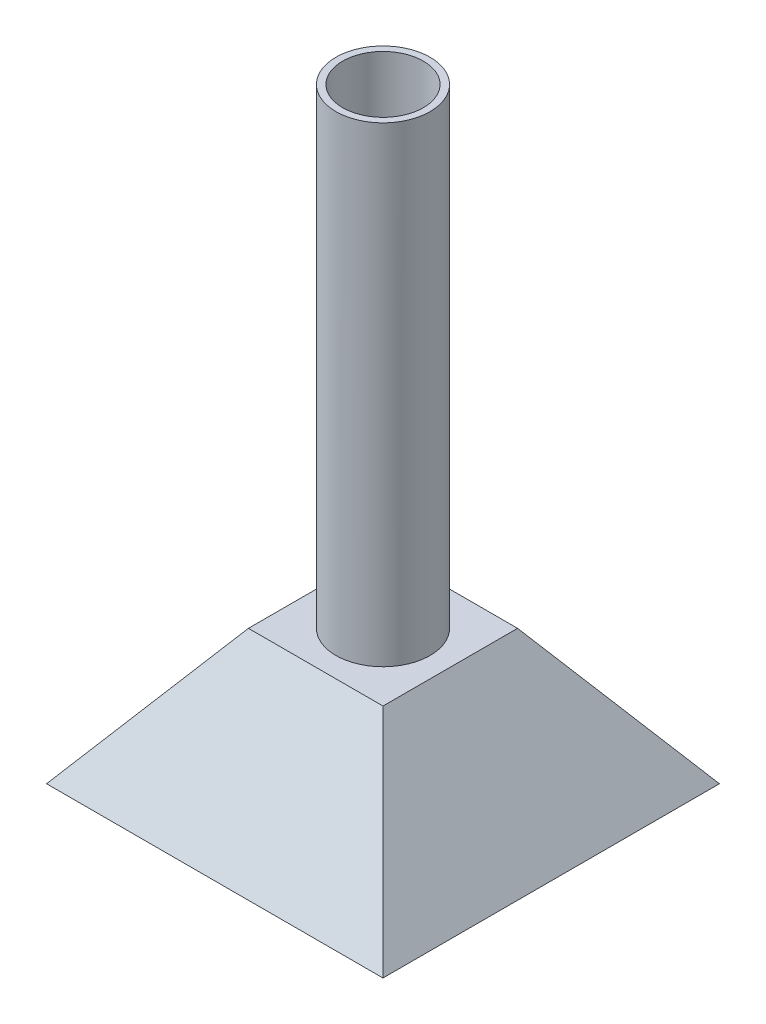
ISO-10303-21;
HEADER;
FILE_DESCRIPTION(('STEP AP214'),'2;1');
FILE_NAME('part.step','',(''),(''),'','','');
FILE_SCHEMA(('AUTOMOTIVE_DESIGN { 1 0 10303 214 1 1 1 1 }'));
ENDSEC;
DATA;
#1=APPLICATION_CONTEXT('core data for automotive mechanical design processes');
#2=APPLICATION_PROTOCOL_DEFINITION('international standard','automotive_design',2000,#1);
#3=PRODUCT_CONTEXT('',#1,'mechanical');
#4=PRODUCT('Part','Part','',(#3));
#5=PRODUCT_RELATED_PRODUCT_CATEGORY('part','',(#4));
#6=PRODUCT_DEFINITION_FORMATION('','',#4);
#7=PRODUCT_DEFINITION_CONTEXT('part definition',#1,'design');
#8=PRODUCT_DEFINITION('design','',#6,#7);
#9=PRODUCT_DEFINITION_SHAPE('','',#8);
#10=(LENGTH_UNIT() NAMED_UNIT(*) SI_UNIT(.MILLI.,.METRE.));
#11=(NAMED_UNIT(*) PLANE_ANGLE_UNIT() SI_UNIT($,.RADIAN.));
#12=(NAMED_UNIT(*) SI_UNIT($,.STERADIAN.) SOLID_ANGLE_UNIT());
#13=UNCERTAINTY_MEASURE_WITH_UNIT(LENGTH_MEASURE(1.E-05),#10,'distance_accuracy_value','');
#14=(GEOMETRIC_REPRESENTATION_CONTEXT(3) GLOBAL_UNCERTAINTY_ASSIGNED_CONTEXT((#13)) GLOBAL_UNIT_ASSIGNED_CONTEXT((#10,
#11,#12)) REPRESENTATION_CONTEXT('',''));
#15=CARTESIAN_POINT('',(0.,0.,0.));
#16=DIRECTION('',(0.,0.,1.));
#17=DIRECTION('',(1.,0.,0.));
#18=AXIS2_PLACEMENT_3D('',#15,#16,#17);
#19=CARTESIAN_POINT('',(0.,0.,0.));
#20=DIRECTION('',(0.,-1.,0.));
#21=DIRECTION('',(0.,0.,-1.));
#22=AXIS2_PLACEMENT_3D('',#19,#20,#21);
#23=PLANE('',#22);
#24=DIRECTION('',(0.,0.,-1.));
#25=VECTOR('',#24,1.);
#26=CARTESIAN_POINT('',(63.5,0.,63.5));
#27=LINE('',#26,#25);
#28=CARTESIAN_POINT('',(63.5,0.,63.5));
#29=VERTEX_POINT('',#28);
#30=CARTESIAN_POINT('',(63.5,0.,-63.5));
#31=VERTEX_POINT('',#30);
#32=EDGE_CURVE('E173',#29,#31,#27,.T.);
#33=ORIENTED_EDGE('',*,*,#32,.F.);
#34=DIRECTION('',(1.,0.,0.));
#35=VECTOR('',#34,1.);
#36=CARTESIAN_POINT('',(-63.5,0.,63.5));
#37=LINE('',#36,#35);
#38=CARTESIAN_POINT('',(-63.5,0.,63.5));
#39=VERTEX_POINT('',#38);
#40=EDGE_CURVE('E57',#39,#29,#37,.T.);
#41=ORIENTED_EDGE('',*,*,#40,.F.);
#42=DIRECTION('',(0.,0.,1.));
#43=VECTOR('',#42,1.);
#44=CARTESIAN_POINT('',(-63.5,0.,63.5));
#45=LINE('',#44,#43);
#46=CARTESIAN_POINT('',(-63.5,0.,-63.5));
#47=VERTEX_POINT('',#46);
#48=EDGE_CURVE('E99',#47,#39,#45,.T.);
#49=ORIENTED_EDGE('',*,*,#48,.F.);
#50=DIRECTION('',(-1.,0.,0.));
#51=VECTOR('',#50,1.);
#52=CARTESIAN_POINT('',(-63.5,0.,-63.5));
#53=LINE('',#52,#51);
#54=EDGE_CURVE('E194',#31,#47,#53,.T.);
#55=ORIENTED_EDGE('',*,*,#54,.F.);
#56=EDGE_LOOP('',(#33,#41,#49,#55));
#57=FACE_BOUND('',#56,.T.);
#58=ADVANCED_FACE('F49',(#57),#23,.T.);
#59=CARTESIAN_POINT('',(0.,50.8,0.));
#60=DIRECTION('',(0.,-1.,0.));
#61=DIRECTION('',(0.,0.,-1.));
#62=AXIS2_PLACEMENT_3D('',#59,#60,#61);
#63=PLANE('',#62);
#64=CARTESIAN_POINT('',(0.,50.8,0.));
#65=DIRECTION('',(0.,-1.,0.));
#66=DIRECTION('',(0.,0.,-1.));
#67=AXIS2_PLACEMENT_3D('',#64,#65,#66);
#68=CIRCLE('',#67,17.78);
#69=CARTESIAN_POINT('',(0.,50.8,-17.78));
#70=VERTEX_POINT('',#69);
#71=EDGE_CURVE('E12',#70,#70,#68,.F.);
#72=ORIENTED_EDGE('',*,*,#71,.F.);
#73=EDGE_LOOP('',(#72));
#74=FACE_BOUND('',#73,.T.);
#75=DIRECTION('',(0.,0.,-1.));
#76=VECTOR('',#75,1.);
#77=CARTESIAN_POINT('',(25.4,50.8,25.4));
#78=LINE('',#77,#76);
#79=CARTESIAN_POINT('',(25.4,50.8,25.4));
#80=VERTEX_POINT('',#79);
#81=CARTESIAN_POINT('',(25.4,50.8,-25.4));
#82=VERTEX_POINT('',#81);
#83=EDGE_CURVE('E161',#80,#82,#78,.T.);
#84=ORIENTED_EDGE('',*,*,#83,.T.);
#85=DIRECTION('',(-1.,0.,0.));
#86=VECTOR('',#85,1.);
#87=CARTESIAN_POINT('',(-25.4,50.8,-25.4));
#88=LINE('',#87,#86);
#89=CARTESIAN_POINT('',(-25.4,50.8,-25.4));
#90=VERTEX_POINT('',#89);
#91=EDGE_CURVE('E117',#82,#90,#88,.T.);
#92=ORIENTED_EDGE('',*,*,#91,.T.);
#93=DIRECTION('',(0.,0.,1.));
#94=VECTOR('',#93,1.);
#95=CARTESIAN_POINT('',(-25.4,50.8,25.4));
#96=LINE('',#95,#94);
#97=CARTESIAN_POINT('',(-25.4,50.8,25.4));
#98=VERTEX_POINT('',#97);
#99=EDGE_CURVE('E96',#90,#98,#96,.T.);
#100=ORIENTED_EDGE('',*,*,#99,.T.);
#101=DIRECTION('',(1.,0.,0.));
#102=VECTOR('',#101,1.);
#103=CARTESIAN_POINT('',(-25.4,50.8,25.4));
#104=LINE('',#103,#102);
#105=EDGE_CURVE('E105',#98,#80,#104,.T.);
#106=ORIENTED_EDGE('',*,*,#105,.T.);
#107=EDGE_LOOP('',(#84,#92,#100,#106));
#108=FACE_BOUND('',#107,.T.);
#109=ADVANCED_FACE('F116',(#74,#108),#63,.F.);
#110=CARTESIAN_POINT('',(-40.64,30.48,0.));
#111=DIRECTION('',(-0.8,0.6,0.));
#112=DIRECTION('',(-0.6,-0.8,0.));
#113=AXIS2_PLACEMENT_3D('',#110,#111,#112);
#114=PLANE('',#113);
#115=DIRECTION('',(-0.514495755427527,-0.685994340570035,-0.514495755427527));
#116=VECTOR('',#115,1.);
#117=CARTESIAN_POINT('',(-25.4,50.8,-25.4));
#118=LINE('',#117,#116);
#119=EDGE_CURVE('E103',#90,#47,#118,.T.);
#120=ORIENTED_EDGE('',*,*,#119,.T.);
#121=ORIENTED_EDGE('',*,*,#48,.T.);
#122=DIRECTION('',(-0.514495755427527,-0.685994340570035,0.514495755427527));
#123=VECTOR('',#122,1.);
#124=CARTESIAN_POINT('',(-25.4,50.8,25.4));
#125=LINE('',#124,#123);
#126=EDGE_CURVE('E91',#98,#39,#125,.T.);
#127=ORIENTED_EDGE('',*,*,#126,.F.);
#128=ORIENTED_EDGE('',*,*,#99,.F.);
#129=EDGE_LOOP('',(#120,#121,#127,#128));
#130=FACE_BOUND('',#129,.T.);
#131=ADVANCED_FACE('F94',(#130),#114,.T.);
#132=CARTESIAN_POINT('',(0.,30.48,40.64));
#133=DIRECTION('',(0.,0.6,0.8));
#134=DIRECTION('',(0.,-0.8,0.6));
#135=AXIS2_PLACEMENT_3D('',#132,#133,#134);
#136=PLANE('',#135);
#137=ORIENTED_EDGE('',*,*,#126,.T.);
#138=ORIENTED_EDGE('',*,*,#40,.T.);
#139=DIRECTION('',(0.514495755427527,-0.685994340570035,0.514495755427527));
#140=VECTOR('',#139,1.);
#141=CARTESIAN_POINT('',(25.4,50.8,25.4));
#142=LINE('',#141,#140);
#143=EDGE_CURVE('E64',#80,#29,#142,.T.);
#144=ORIENTED_EDGE('',*,*,#143,.F.);
#145=ORIENTED_EDGE('',*,*,#105,.F.);
#146=EDGE_LOOP('',(#137,#138,#144,#145));
#147=FACE_BOUND('',#146,.T.);
#148=ADVANCED_FACE('F107',(#147),#136,.T.);
#149=CARTESIAN_POINT('',(0.,30.48,-40.64));
#150=DIRECTION('',(0.,0.6,-0.8));
#151=DIRECTION('',(0.,0.8,0.6));
#152=AXIS2_PLACEMENT_3D('',#149,#150,#151);
#153=PLANE('',#152);
#154=DIRECTION('',(0.514495755427527,-0.685994340570035,-0.514495755427527));
#155=VECTOR('',#154,1.);
#156=CARTESIAN_POINT('',(25.4,50.8,-25.4));
#157=LINE('',#156,#155);
#158=EDGE_CURVE('E102',#82,#31,#157,.T.);
#159=ORIENTED_EDGE('',*,*,#158,.T.);
#160=ORIENTED_EDGE('',*,*,#54,.T.);
#161=ORIENTED_EDGE('',*,*,#119,.F.);
#162=ORIENTED_EDGE('',*,*,#91,.F.);
#163=EDGE_LOOP('',(#159,#160,#161,#162));
#164=FACE_BOUND('',#163,.T.);
#165=ADVANCED_FACE('F233',(#164),#153,.T.);
#166=CARTESIAN_POINT('',(40.64,30.48,0.));
#167=DIRECTION('',(0.8,0.6,0.));
#168=DIRECTION('',(-0.6,0.8,0.));
#169=AXIS2_PLACEMENT_3D('',#166,#167,#168);
#170=PLANE('',#169);
#171=ORIENTED_EDGE('',*,*,#143,.T.);
#172=ORIENTED_EDGE('',*,*,#32,.T.);
#173=ORIENTED_EDGE('',*,*,#158,.F.);
#174=ORIENTED_EDGE('',*,*,#83,.F.);
#175=EDGE_LOOP('',(#171,#172,#173,#174));
#176=FACE_BOUND('',#175,.T.);
#177=ADVANCED_FACE('F241',(#176),#170,.T.);
#178=CARTESIAN_POINT('',(0.,228.6,0.));
#179=DIRECTION('',(0.,1.,0.));
#180=DIRECTION('',(0.,0.,1.));
#181=AXIS2_PLACEMENT_3D('',#178,#179,#180);
#182=PLANE('',#181);
#183=CARTESIAN_POINT('',(0.,228.6,0.));
#184=DIRECTION('',(0.,1.,0.));
#185=DIRECTION('',(0.,0.,1.));
#186=AXIS2_PLACEMENT_3D('',#183,#184,#185);
#187=CIRCLE('',#186,17.78);
#188=CARTESIAN_POINT('',(0.,228.6,17.78));
#189=VERTEX_POINT('',#188);
#190=EDGE_CURVE('E291',#189,#189,#187,.T.);
#191=ORIENTED_EDGE('',*,*,#190,.T.);
#192=EDGE_LOOP('',(#191));
#193=FACE_BOUND('',#192,.T.);
#194=CARTESIAN_POINT('',(0.,228.6,0.));
#195=DIRECTION('',(0.,1.,0.));
#196=DIRECTION('',(0.,0.,1.));
#197=AXIS2_PLACEMENT_3D('',#194,#195,#196);
#198=CIRCLE('',#197,15.24);
#199=CARTESIAN_POINT('',(0.,228.6,15.24));
#200=VERTEX_POINT('',#199);
#201=EDGE_CURVE('E293',#200,#200,#198,.T.);
#202=ORIENTED_EDGE('',*,*,#201,.F.);
#203=EDGE_LOOP('',(#202));
#204=FACE_BOUND('',#203,.T.);
#205=ADVANCED_FACE('F313',(#193,#204),#182,.T.);
#206=CARTESIAN_POINT('',(0.,228.6,0.));
#207=DIRECTION('',(0.,-1.,0.));
#208=DIRECTION('',(0.,0.,-1.));
#209=AXIS2_PLACEMENT_3D('',#206,#207,#208);
#210=CYLINDRICAL_SURFACE('',#209,17.78);
#211=ORIENTED_EDGE('',*,*,#190,.F.);
#212=EDGE_LOOP('',(#211));
#213=FACE_BOUND('',#212,.T.);
#214=ORIENTED_EDGE('',*,*,#71,.T.);
#215=EDGE_LOOP('',(#214));
#216=FACE_BOUND('',#215,.T.);
#217=ADVANCED_FACE('F139',(#213,#216),#210,.T.);
#218=CARTESIAN_POINT('',(0.,228.6,0.));
#219=DIRECTION('',(0.,-1.,0.));
#220=DIRECTION('',(0.,0.,-1.));
#221=AXIS2_PLACEMENT_3D('',#218,#219,#220);
#222=CYLINDRICAL_SURFACE('',#221,15.24);
#223=ORIENTED_EDGE('',*,*,#201,.T.);
#224=EDGE_LOOP('',(#223));
#225=FACE_BOUND('',#224,.T.);
#226=CARTESIAN_POINT('',(0.,50.8,0.));
#227=DIRECTION('',(0.,1.,0.));
#228=DIRECTION('',(0.,0.,1.));
#229=AXIS2_PLACEMENT_3D('',#226,#227,#228);
#230=CIRCLE('',#229,15.24);
#231=CARTESIAN_POINT('',(0.,50.8,15.24));
#232=VERTEX_POINT('',#231);
#233=EDGE_CURVE('E298',#232,#232,#230,.T.);
#234=ORIENTED_EDGE('',*,*,#233,.F.);
#235=EDGE_LOOP('',(#234));
#236=FACE_BOUND('',#235,.T.);
#237=ADVANCED_FACE('F305',(#225,#236),#222,.F.);
#238=ORIENTED_EDGE('',*,*,#233,.T.);
#239=EDGE_LOOP('',(#238));
#240=FACE_BOUND('',#239,.T.);
#241=ADVANCED_FACE('F138',(#240),#63,.F.);
#242=CLOSED_SHELL('',(#58,#109,#131,#148,#165,#177,#205,#217,#237,#241));
#243=MANIFOLD_SOLID_BREP('B2',#242);
#244=ADVANCED_BREP_SHAPE_REPRESENTATION('',(#18,#243),#14);
#245=SHAPE_DEFINITION_REPRESENTATION(#9,#244);
ENDSEC;
END-ISO-10303-21;
